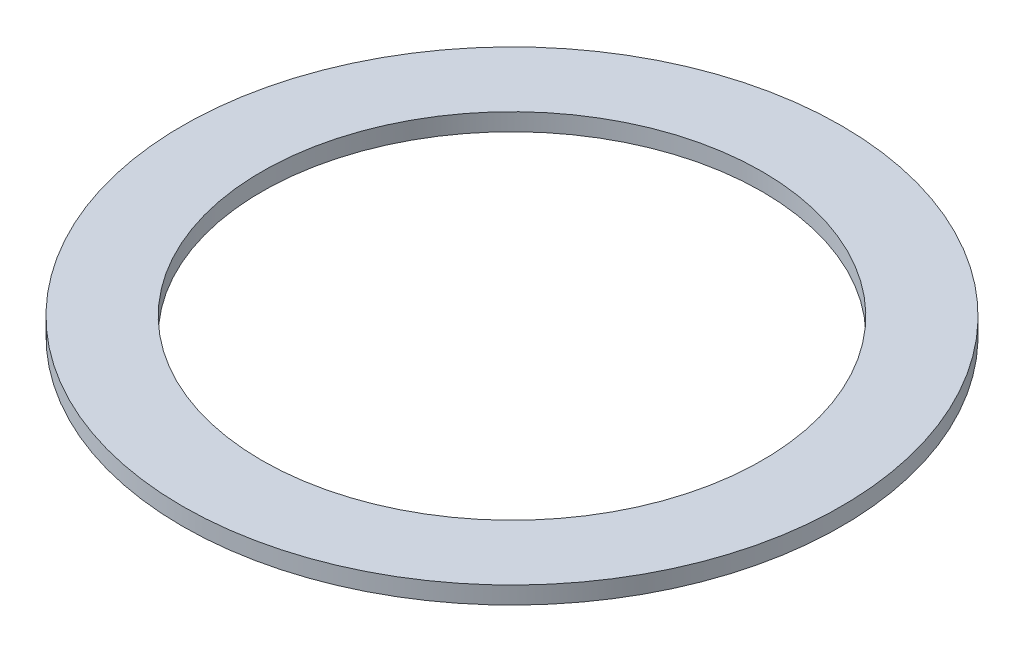
ISO-10303-21;
HEADER;
FILE_DESCRIPTION(('STEP AP214'),'2;1');
FILE_NAME('part.step','',(''),(''),'','','');
FILE_SCHEMA(('AUTOMOTIVE_DESIGN { 1 0 10303 214 1 1 1 1 }'));
ENDSEC;
DATA;
#1=APPLICATION_CONTEXT('core data for automotive mechanical design processes');
#2=APPLICATION_PROTOCOL_DEFINITION('international standard','automotive_design',2000,#1);
#3=PRODUCT_CONTEXT('',#1,'mechanical');
#4=PRODUCT('Part','Part','',(#3));
#5=PRODUCT_RELATED_PRODUCT_CATEGORY('part','',(#4));
#6=PRODUCT_DEFINITION_FORMATION('','',#4);
#7=PRODUCT_DEFINITION_CONTEXT('part definition',#1,'design');
#8=PRODUCT_DEFINITION('design','',#6,#7);
#9=PRODUCT_DEFINITION_SHAPE('','',#8);
#10=(LENGTH_UNIT() NAMED_UNIT(*) SI_UNIT(.MILLI.,.METRE.));
#11=(NAMED_UNIT(*) PLANE_ANGLE_UNIT() SI_UNIT($,.RADIAN.));
#12=(NAMED_UNIT(*) SI_UNIT($,.STERADIAN.) SOLID_ANGLE_UNIT());
#13=UNCERTAINTY_MEASURE_WITH_UNIT(LENGTH_MEASURE(1.E-05),#10,'distance_accuracy_value','');
#14=(GEOMETRIC_REPRESENTATION_CONTEXT(3) GLOBAL_UNCERTAINTY_ASSIGNED_CONTEXT((#13)) GLOBAL_UNIT_ASSIGNED_CONTEXT((#10,
#11,#12)) REPRESENTATION_CONTEXT('',''));
#15=CARTESIAN_POINT('',(0.,0.,0.));
#16=DIRECTION('',(0.,0.,1.));
#17=DIRECTION('',(1.,0.,0.));
#18=AXIS2_PLACEMENT_3D('',#15,#16,#17);
#19=CARTESIAN_POINT('',(0.,2.0066,0.));
#20=DIRECTION('',(0.,1.,0.));
#21=DIRECTION('',(0.,0.,1.));
#22=AXIS2_PLACEMENT_3D('',#19,#20,#21);
#23=PLANE('',#22);
#24=CARTESIAN_POINT('',(0.,2.0066,0.));
#25=DIRECTION('',(0.,1.,0.));
#26=DIRECTION('',(0.,0.,1.));
#27=AXIS2_PLACEMENT_3D('',#24,#25,#26);
#28=CIRCLE('',#27,38.0746);
#29=CARTESIAN_POINT('',(0.,2.0066,38.0746));
#30=VERTEX_POINT('',#29);
#31=EDGE_CURVE('E10',#30,#30,#28,.T.);
#32=ORIENTED_EDGE('',*,*,#31,.T.);
#33=EDGE_LOOP('',(#32));
#34=FACE_BOUND('',#33,.T.);
#35=CARTESIAN_POINT('',(0.,2.0066,0.));
#36=DIRECTION('',(0.,1.,0.));
#37=DIRECTION('',(0.,0.,1.));
#38=AXIS2_PLACEMENT_3D('',#35,#36,#37);
#39=CIRCLE('',#38,28.9052);
#40=CARTESIAN_POINT('',(0.,2.0066,28.9052));
#41=VERTEX_POINT('',#40);
#42=EDGE_CURVE('E48',#41,#41,#39,.T.);
#43=ORIENTED_EDGE('',*,*,#42,.F.);
#44=EDGE_LOOP('',(#43));
#45=FACE_BOUND('',#44,.T.);
#46=ADVANCED_FACE('F37',(#34,#45),#23,.T.);
#47=CARTESIAN_POINT('',(0.,0.,0.));
#48=DIRECTION('',(0.,1.,0.));
#49=DIRECTION('',(0.,0.,1.));
#50=AXIS2_PLACEMENT_3D('',#47,#48,#49);
#51=PLANE('',#50);
#52=CARTESIAN_POINT('',(0.,0.,0.));
#53=DIRECTION('',(0.,1.,0.));
#54=DIRECTION('',(0.,0.,1.));
#55=AXIS2_PLACEMENT_3D('',#52,#53,#54);
#56=CIRCLE('',#55,38.0746);
#57=CARTESIAN_POINT('',(0.,0.,38.0746));
#58=VERTEX_POINT('',#57);
#59=EDGE_CURVE('E41',#58,#58,#56,.T.);
#60=ORIENTED_EDGE('',*,*,#59,.F.);
#61=EDGE_LOOP('',(#60));
#62=FACE_BOUND('',#61,.T.);
#63=CARTESIAN_POINT('',(0.,0.,0.));
#64=DIRECTION('',(0.,1.,0.));
#65=DIRECTION('',(0.,0.,1.));
#66=AXIS2_PLACEMENT_3D('',#63,#64,#65);
#67=CIRCLE('',#66,28.9052);
#68=CARTESIAN_POINT('',(0.,0.,28.9052));
#69=VERTEX_POINT('',#68);
#70=EDGE_CURVE('E50',#69,#69,#67,.T.);
#71=ORIENTED_EDGE('',*,*,#70,.T.);
#72=EDGE_LOOP('',(#71));
#73=FACE_BOUND('',#72,.T.);
#74=ADVANCED_FACE('F60',(#62,#73),#51,.F.);
#75=CARTESIAN_POINT('',(0.,2.0066,0.));
#76=DIRECTION('',(0.,-1.,0.));
#77=DIRECTION('',(0.,0.,-1.));
#78=AXIS2_PLACEMENT_3D('',#75,#76,#77);
#79=CYLINDRICAL_SURFACE('',#78,38.0746);
#80=ORIENTED_EDGE('',*,*,#31,.F.);
#81=EDGE_LOOP('',(#80));
#82=FACE_BOUND('',#81,.T.);
#83=ORIENTED_EDGE('',*,*,#59,.T.);
#84=EDGE_LOOP('',(#83));
#85=FACE_BOUND('',#84,.T.);
#86=ADVANCED_FACE('F39',(#82,#85),#79,.T.);
#87=CARTESIAN_POINT('',(0.,2.0066,0.));
#88=DIRECTION('',(0.,-1.,0.));
#89=DIRECTION('',(0.,0.,-1.));
#90=AXIS2_PLACEMENT_3D('',#87,#88,#89);
#91=CYLINDRICAL_SURFACE('',#90,28.9052);
#92=ORIENTED_EDGE('',*,*,#42,.T.);
#93=EDGE_LOOP('',(#92));
#94=FACE_BOUND('',#93,.T.);
#95=ORIENTED_EDGE('',*,*,#70,.F.);
#96=EDGE_LOOP('',(#95));
#97=FACE_BOUND('',#96,.T.);
#98=ADVANCED_FACE('F56',(#94,#97),#91,.F.);
#99=CLOSED_SHELL('',(#46,#74,#86,#98));
#100=MANIFOLD_SOLID_BREP('B2',#99);
#101=ADVANCED_BREP_SHAPE_REPRESENTATION('',(#18,#100),#14);
#102=SHAPE_DEFINITION_REPRESENTATION(#9,#101);
ENDSEC;
END-ISO-10303-21;
